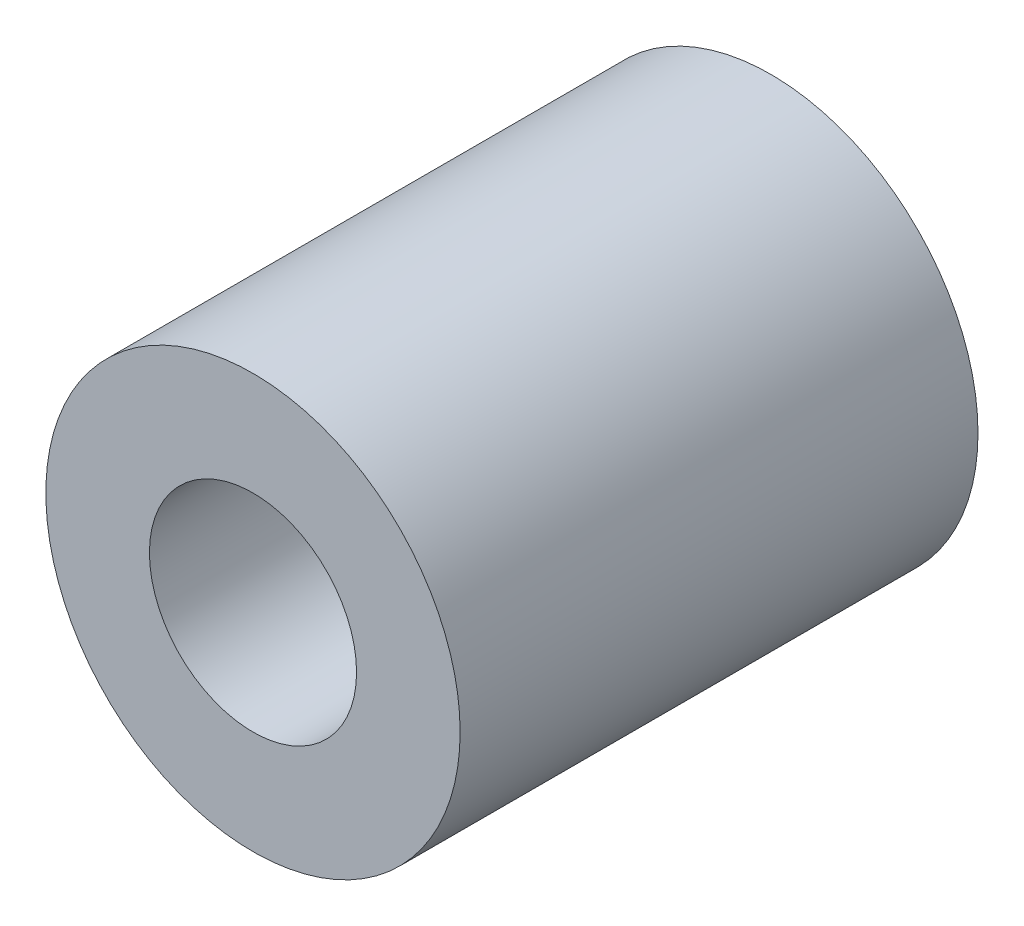
ISO-10303-21;
HEADER;
FILE_DESCRIPTION(('STEP AP214'),'2;1');
FILE_NAME('part.step','',(''),(''),'','','');
FILE_SCHEMA(('AUTOMOTIVE_DESIGN { 1 0 10303 214 1 1 1 1 }'));
ENDSEC;
DATA;
#1=APPLICATION_CONTEXT('core data for automotive mechanical design processes');
#2=APPLICATION_PROTOCOL_DEFINITION('international standard','automotive_design',2000,#1);
#3=PRODUCT_CONTEXT('',#1,'mechanical');
#4=PRODUCT('Part','Part','',(#3));
#5=PRODUCT_RELATED_PRODUCT_CATEGORY('part','',(#4));
#6=PRODUCT_DEFINITION_FORMATION('','',#4);
#7=PRODUCT_DEFINITION_CONTEXT('part definition',#1,'design');
#8=PRODUCT_DEFINITION('design','',#6,#7);
#9=PRODUCT_DEFINITION_SHAPE('','',#8);
#10=(LENGTH_UNIT() NAMED_UNIT(*) SI_UNIT(.MILLI.,.METRE.));
#11=(NAMED_UNIT(*) PLANE_ANGLE_UNIT() SI_UNIT($,.RADIAN.));
#12=(NAMED_UNIT(*) SI_UNIT($,.STERADIAN.) SOLID_ANGLE_UNIT());
#13=UNCERTAINTY_MEASURE_WITH_UNIT(LENGTH_MEASURE(1.E-05),#10,'distance_accuracy_value','');
#14=(GEOMETRIC_REPRESENTATION_CONTEXT(3) GLOBAL_UNCERTAINTY_ASSIGNED_CONTEXT((#13)) GLOBAL_UNIT_ASSIGNED_CONTEXT((#10,
#11,#12)) REPRESENTATION_CONTEXT('',''));
#15=CARTESIAN_POINT('',(0.,0.,0.));
#16=DIRECTION('',(0.,0.,1.));
#17=DIRECTION('',(1.,0.,0.));
#18=AXIS2_PLACEMENT_3D('',#15,#16,#17);
#19=CARTESIAN_POINT('',(0.,0.,25.));
#20=DIRECTION('',(0.,0.,-1.));
#21=DIRECTION('',(-1.,0.,0.));
#22=AXIS2_PLACEMENT_3D('',#19,#20,#21);
#23=CYLINDRICAL_SURFACE('',#22,4.);
#24=CARTESIAN_POINT('',(0.,0.,0.));
#25=DIRECTION('',(0.,0.,1.));
#26=DIRECTION('',(1.,0.,0.));
#27=AXIS2_PLACEMENT_3D('',#24,#25,#26);
#28=CIRCLE('',#27,4.);
#29=CARTESIAN_POINT('',(4.,0.,0.));
#30=VERTEX_POINT('',#29);
#31=EDGE_CURVE('E46',#30,#30,#28,.T.);
#32=ORIENTED_EDGE('',*,*,#31,.F.);
#33=EDGE_LOOP('',(#32));
#34=FACE_BOUND('',#33,.T.);
#35=CARTESIAN_POINT('',(0.,0.,12.5));
#36=DIRECTION('',(0.,0.,1.));
#37=DIRECTION('',(1.,0.,0.));
#38=AXIS2_PLACEMENT_3D('',#35,#36,#37);
#39=CIRCLE('',#38,4.);
#40=CARTESIAN_POINT('',(4.,0.,12.5));
#41=VERTEX_POINT('',#40);
#42=EDGE_CURVE('E37',#41,#41,#39,.T.);
#43=ORIENTED_EDGE('',*,*,#42,.T.);
#44=EDGE_LOOP('',(#43));
#45=FACE_BOUND('',#44,.T.);
#46=ADVANCED_FACE('F33',(#34,#45),#23,.F.);
#47=CARTESIAN_POINT('',(0.,0.,25.));
#48=DIRECTION('',(0.,0.,1.));
#49=DIRECTION('',(1.,0.,0.));
#50=AXIS2_PLACEMENT_3D('',#47,#48,#49);
#51=PLANE('',#50);
#52=CARTESIAN_POINT('',(0.,0.,25.));
#53=DIRECTION('',(0.,0.,1.));
#54=DIRECTION('',(1.,0.,0.));
#55=AXIS2_PLACEMENT_3D('',#52,#53,#54);
#56=CIRCLE('',#55,5.);
#57=CARTESIAN_POINT('',(5.,0.,25.));
#58=VERTEX_POINT('',#57);
#59=EDGE_CURVE('E50',#58,#58,#56,.T.);
#60=ORIENTED_EDGE('',*,*,#59,.F.);
#61=EDGE_LOOP('',(#60));
#62=FACE_BOUND('',#61,.T.);
#63=CARTESIAN_POINT('',(0.,0.,25.));
#64=DIRECTION('',(0.,0.,1.));
#65=DIRECTION('',(1.,0.,0.));
#66=AXIS2_PLACEMENT_3D('',#63,#64,#65);
#67=CIRCLE('',#66,10.);
#68=CARTESIAN_POINT('',(10.,0.,25.));
#69=VERTEX_POINT('',#68);
#70=EDGE_CURVE('E10',#69,#69,#67,.T.);
#71=ORIENTED_EDGE('',*,*,#70,.T.);
#72=EDGE_LOOP('',(#71));
#73=FACE_BOUND('',#72,.T.);
#74=ADVANCED_FACE('F71',(#62,#73),#51,.T.);
#75=CARTESIAN_POINT('',(0.,0.,0.));
#76=DIRECTION('',(0.,0.,1.));
#77=DIRECTION('',(1.,0.,0.));
#78=AXIS2_PLACEMENT_3D('',#75,#76,#77);
#79=PLANE('',#78);
#80=CARTESIAN_POINT('',(0.,0.,0.));
#81=DIRECTION('',(0.,0.,1.));
#82=DIRECTION('',(1.,0.,0.));
#83=AXIS2_PLACEMENT_3D('',#80,#81,#82);
#84=CIRCLE('',#83,10.);
#85=CARTESIAN_POINT('',(10.,0.,0.));
#86=VERTEX_POINT('',#85);
#87=EDGE_CURVE('E41',#86,#86,#84,.T.);
#88=ORIENTED_EDGE('',*,*,#87,.F.);
#89=EDGE_LOOP('',(#88));
#90=FACE_BOUND('',#89,.T.);
#91=ORIENTED_EDGE('',*,*,#31,.T.);
#92=EDGE_LOOP('',(#91));
#93=FACE_BOUND('',#92,.T.);
#94=ADVANCED_FACE('F77',(#90,#93),#79,.F.);
#95=CARTESIAN_POINT('',(0.,0.,25.));
#96=DIRECTION('',(0.,0.,-1.));
#97=DIRECTION('',(-1.,0.,0.));
#98=AXIS2_PLACEMENT_3D('',#95,#96,#97);
#99=CYLINDRICAL_SURFACE('',#98,10.);
#100=ORIENTED_EDGE('',*,*,#70,.F.);
#101=EDGE_LOOP('',(#100));
#102=FACE_BOUND('',#101,.T.);
#103=ORIENTED_EDGE('',*,*,#87,.T.);
#104=EDGE_LOOP('',(#103));
#105=FACE_BOUND('',#104,.T.);
#106=ADVANCED_FACE('F35',(#102,#105),#99,.T.);
#107=CARTESIAN_POINT('',(0.,0.,12.5));
#108=DIRECTION('',(0.,0.,1.));
#109=DIRECTION('',(1.,0.,0.));
#110=AXIS2_PLACEMENT_3D('',#107,#108,#109);
#111=CYLINDRICAL_SURFACE('',#110,5.);
#112=CARTESIAN_POINT('',(0.,0.,12.5));
#113=DIRECTION('',(0.,0.,1.));
#114=DIRECTION('',(1.,0.,0.));
#115=AXIS2_PLACEMENT_3D('',#112,#113,#114);
#116=CIRCLE('',#115,5.);
#117=CARTESIAN_POINT('',(5.,0.,12.5));
#118=VERTEX_POINT('',#117);
#119=EDGE_CURVE('E53',#118,#118,#116,.T.);
#120=ORIENTED_EDGE('',*,*,#119,.F.);
#121=EDGE_LOOP('',(#120));
#122=FACE_BOUND('',#121,.T.);
#123=ORIENTED_EDGE('',*,*,#59,.T.);
#124=EDGE_LOOP('',(#123));
#125=FACE_BOUND('',#124,.T.);
#126=ADVANCED_FACE('F63',(#122,#125),#111,.F.);
#127=CARTESIAN_POINT('',(0.,0.,12.5));
#128=DIRECTION('',(0.,0.,1.));
#129=DIRECTION('',(1.,0.,0.));
#130=AXIS2_PLACEMENT_3D('',#127,#128,#129);
#131=PLANE('',#130);
#132=ORIENTED_EDGE('',*,*,#42,.F.);
#133=EDGE_LOOP('',(#132));
#134=FACE_BOUND('',#133,.T.);
#135=ORIENTED_EDGE('',*,*,#119,.T.);
#136=EDGE_LOOP('',(#135));
#137=FACE_BOUND('',#136,.T.);
#138=ADVANCED_FACE('F61',(#134,#137),#131,.T.);
#139=CLOSED_SHELL('',(#46,#74,#94,#106,#126,#138));
#140=MANIFOLD_SOLID_BREP('B2',#139);
#141=ADVANCED_BREP_SHAPE_REPRESENTATION('',(#18,#140),#14);
#142=SHAPE_DEFINITION_REPRESENTATION(#9,#141);
ENDSEC;
END-ISO-10303-21;
